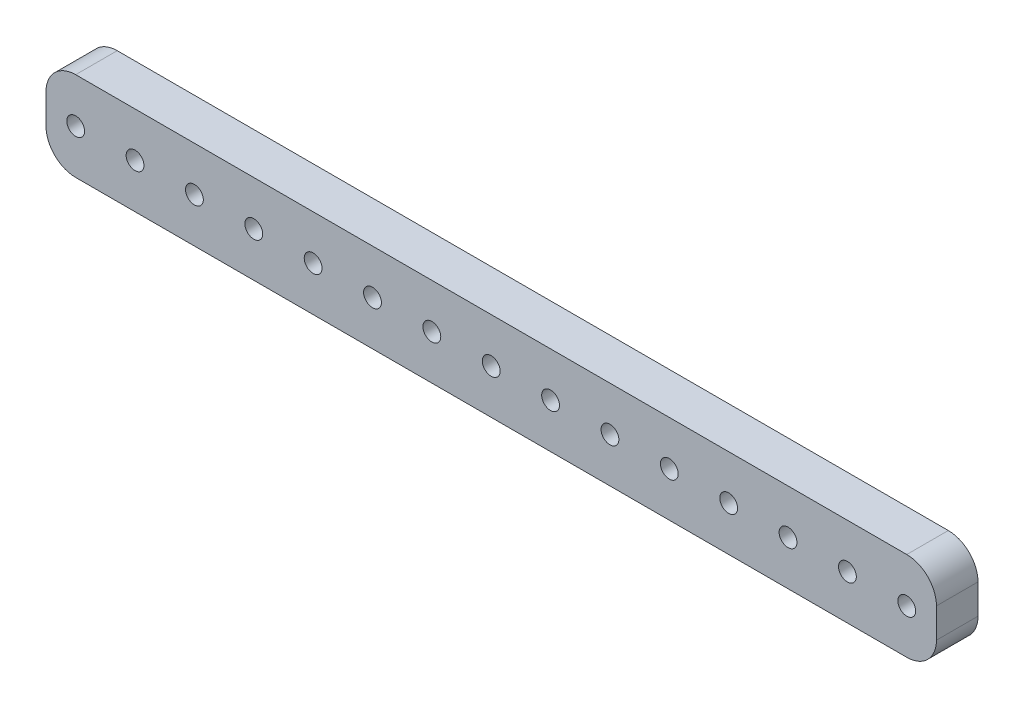
ISO-10303-21;
HEADER;
FILE_DESCRIPTION(('STEP AP214'),'2;1');
FILE_NAME('part.step','',(''),(''),'','','');
FILE_SCHEMA(('AUTOMOTIVE_DESIGN { 1 0 10303 214 1 1 1 1 }'));
ENDSEC;
DATA;
#1=APPLICATION_CONTEXT('core data for automotive mechanical design processes');
#2=APPLICATION_PROTOCOL_DEFINITION('international standard','automotive_design',2000,#1);
#3=PRODUCT_CONTEXT('',#1,'mechanical');
#4=PRODUCT('Part','Part','',(#3));
#5=PRODUCT_RELATED_PRODUCT_CATEGORY('part','',(#4));
#6=PRODUCT_DEFINITION_FORMATION('','',#4);
#7=PRODUCT_DEFINITION_CONTEXT('part definition',#1,'design');
#8=PRODUCT_DEFINITION('design','',#6,#7);
#9=PRODUCT_DEFINITION_SHAPE('','',#8);
#10=(LENGTH_UNIT() NAMED_UNIT(*) SI_UNIT(.MILLI.,.METRE.));
#11=(NAMED_UNIT(*) PLANE_ANGLE_UNIT() SI_UNIT($,.RADIAN.));
#12=(NAMED_UNIT(*) SI_UNIT($,.STERADIAN.) SOLID_ANGLE_UNIT());
#13=UNCERTAINTY_MEASURE_WITH_UNIT(LENGTH_MEASURE(1.E-05),#10,'distance_accuracy_value','');
#14=(GEOMETRIC_REPRESENTATION_CONTEXT(3) GLOBAL_UNCERTAINTY_ASSIGNED_CONTEXT((#13)) GLOBAL_UNIT_ASSIGNED_CONTEXT((#10,
#11,#12)) REPRESENTATION_CONTEXT('',''));
#15=CARTESIAN_POINT('',(0.,0.,0.));
#16=DIRECTION('',(0.,0.,1.));
#17=DIRECTION('',(1.,0.,0.));
#18=AXIS2_PLACEMENT_3D('',#15,#16,#17);
#19=CARTESIAN_POINT('',(150.,15.,14.));
#20=DIRECTION('',(-1.,0.,0.));
#21=DIRECTION('',(0.,0.,1.));
#22=AXIS2_PLACEMENT_3D('',#19,#20,#21);
#23=PLANE('',#22);
#24=DIRECTION('',(0.,1.,0.));
#25=VECTOR('',#24,1.);
#26=CARTESIAN_POINT('',(150.,15.,14.));
#27=LINE('',#26,#25);
#28=CARTESIAN_POINT('',(150.,-5.,14.));
#29=VERTEX_POINT('',#28);
#30=CARTESIAN_POINT('',(150.,5.,14.));
#31=VERTEX_POINT('',#30);
#32=EDGE_CURVE('E126',#29,#31,#27,.T.);
#33=ORIENTED_EDGE('',*,*,#32,.F.);
#34=DIRECTION('',(0.,0.,-1.));
#35=VECTOR('',#34,1.);
#36=CARTESIAN_POINT('',(150.,-5.,14.));
#37=LINE('',#36,#35);
#38=CARTESIAN_POINT('',(150.,-5.,0.));
#39=VERTEX_POINT('',#38);
#40=EDGE_CURVE('E11',#29,#39,#37,.T.);
#41=ORIENTED_EDGE('',*,*,#40,.T.);
#42=DIRECTION('',(0.,1.,0.));
#43=VECTOR('',#42,1.);
#44=CARTESIAN_POINT('',(150.,15.,0.));
#45=LINE('',#44,#43);
#46=CARTESIAN_POINT('',(150.,5.,0.));
#47=VERTEX_POINT('',#46);
#48=EDGE_CURVE('E157',#39,#47,#45,.T.);
#49=ORIENTED_EDGE('',*,*,#48,.T.);
#50=DIRECTION('',(0.,0.,-1.));
#51=VECTOR('',#50,1.);
#52=CARTESIAN_POINT('',(150.,5.,14.));
#53=LINE('',#52,#51);
#54=EDGE_CURVE('E40',#47,#31,#53,.F.);
#55=ORIENTED_EDGE('',*,*,#54,.T.);
#56=EDGE_LOOP('',(#33,#41,#49,#55));
#57=FACE_BOUND('',#56,.T.);
#58=ADVANCED_FACE('F32',(#57),#23,.F.);
#59=CARTESIAN_POINT('',(-150.,15.,14.));
#60=DIRECTION('',(0.,-1.,0.));
#61=DIRECTION('',(0.,0.,-1.));
#62=AXIS2_PLACEMENT_3D('',#59,#60,#61);
#63=PLANE('',#62);
#64=DIRECTION('',(-1.,0.,0.));
#65=VECTOR('',#64,1.);
#66=CARTESIAN_POINT('',(-150.,15.,0.));
#67=LINE('',#66,#65);
#68=CARTESIAN_POINT('',(140.,15.,0.));
#69=VERTEX_POINT('',#68);
#70=CARTESIAN_POINT('',(-140.,15.,0.));
#71=VERTEX_POINT('',#70);
#72=EDGE_CURVE('E131',#69,#71,#67,.T.);
#73=ORIENTED_EDGE('',*,*,#72,.T.);
#74=DIRECTION('',(0.,0.,-1.));
#75=VECTOR('',#74,1.);
#76=CARTESIAN_POINT('',(-140.,15.,14.));
#77=LINE('',#76,#75);
#78=CARTESIAN_POINT('',(-140.,15.,14.));
#79=VERTEX_POINT('',#78);
#80=EDGE_CURVE('E47',#71,#79,#77,.F.);
#81=ORIENTED_EDGE('',*,*,#80,.T.);
#82=DIRECTION('',(-1.,0.,0.));
#83=VECTOR('',#82,1.);
#84=CARTESIAN_POINT('',(-150.,15.,14.));
#85=LINE('',#84,#83);
#86=CARTESIAN_POINT('',(140.,15.,14.));
#87=VERTEX_POINT('',#86);
#88=EDGE_CURVE('E129',#87,#79,#85,.T.);
#89=ORIENTED_EDGE('',*,*,#88,.F.);
#90=DIRECTION('',(0.,0.,-1.));
#91=VECTOR('',#90,1.);
#92=CARTESIAN_POINT('',(140.,15.,14.));
#93=LINE('',#92,#91);
#94=EDGE_CURVE('E149',#87,#69,#93,.T.);
#95=ORIENTED_EDGE('',*,*,#94,.T.);
#96=EDGE_LOOP('',(#73,#81,#89,#95));
#97=FACE_BOUND('',#96,.T.);
#98=ADVANCED_FACE('F164',(#97),#63,.F.);
#99=CARTESIAN_POINT('',(-150.,15.,14.));
#100=DIRECTION('',(1.,0.,0.));
#101=DIRECTION('',(0.,0.,-1.));
#102=AXIS2_PLACEMENT_3D('',#99,#100,#101);
#103=PLANE('',#102);
#104=DIRECTION('',(0.,-1.,0.));
#105=VECTOR('',#104,1.);
#106=CARTESIAN_POINT('',(-150.,15.,0.));
#107=LINE('',#106,#105);
#108=CARTESIAN_POINT('',(-150.,5.,0.));
#109=VERTEX_POINT('',#108);
#110=CARTESIAN_POINT('',(-150.,-5.,0.));
#111=VERTEX_POINT('',#110);
#112=EDGE_CURVE('E127',#109,#111,#107,.T.);
#113=ORIENTED_EDGE('',*,*,#112,.T.);
#114=DIRECTION('',(0.,0.,-1.));
#115=VECTOR('',#114,1.);
#116=CARTESIAN_POINT('',(-150.,-5.,14.));
#117=LINE('',#116,#115);
#118=CARTESIAN_POINT('',(-150.,-5.,14.));
#119=VERTEX_POINT('',#118);
#120=EDGE_CURVE('E104',#111,#119,#117,.F.);
#121=ORIENTED_EDGE('',*,*,#120,.T.);
#122=DIRECTION('',(0.,-1.,0.));
#123=VECTOR('',#122,1.);
#124=CARTESIAN_POINT('',(-150.,15.,14.));
#125=LINE('',#124,#123);
#126=CARTESIAN_POINT('',(-150.,5.,14.));
#127=VERTEX_POINT('',#126);
#128=EDGE_CURVE('E169',#127,#119,#125,.T.);
#129=ORIENTED_EDGE('',*,*,#128,.F.);
#130=DIRECTION('',(0.,0.,-1.));
#131=VECTOR('',#130,1.);
#132=CARTESIAN_POINT('',(-150.,5.,14.));
#133=LINE('',#132,#131);
#134=EDGE_CURVE('E109',#127,#109,#133,.T.);
#135=ORIENTED_EDGE('',*,*,#134,.T.);
#136=EDGE_LOOP('',(#113,#121,#129,#135));
#137=FACE_BOUND('',#136,.T.);
#138=ADVANCED_FACE('F314',(#137),#103,.F.);
#139=CARTESIAN_POINT('',(-150.,-15.,14.));
#140=DIRECTION('',(0.,1.,0.));
#141=DIRECTION('',(0.,0.,1.));
#142=AXIS2_PLACEMENT_3D('',#139,#140,#141);
#143=PLANE('',#142);
#144=DIRECTION('',(1.,0.,0.));
#145=VECTOR('',#144,1.);
#146=CARTESIAN_POINT('',(-150.,-15.,14.));
#147=LINE('',#146,#145);
#148=CARTESIAN_POINT('',(-140.,-15.,14.));
#149=VERTEX_POINT('',#148);
#150=CARTESIAN_POINT('',(140.,-15.,14.));
#151=VERTEX_POINT('',#150);
#152=EDGE_CURVE('E119',#149,#151,#147,.T.);
#153=ORIENTED_EDGE('',*,*,#152,.F.);
#154=DIRECTION('',(0.,0.,-1.));
#155=VECTOR('',#154,1.);
#156=CARTESIAN_POINT('',(-140.,-15.,14.));
#157=LINE('',#156,#155);
#158=CARTESIAN_POINT('',(-140.,-15.,0.));
#159=VERTEX_POINT('',#158);
#160=EDGE_CURVE('E103',#149,#159,#157,.T.);
#161=ORIENTED_EDGE('',*,*,#160,.T.);
#162=DIRECTION('',(1.,0.,0.));
#163=VECTOR('',#162,1.);
#164=CARTESIAN_POINT('',(-150.,-15.,0.));
#165=LINE('',#164,#163);
#166=CARTESIAN_POINT('',(140.,-15.,0.));
#167=VERTEX_POINT('',#166);
#168=EDGE_CURVE('E116',#159,#167,#165,.T.);
#169=ORIENTED_EDGE('',*,*,#168,.T.);
#170=DIRECTION('',(0.,0.,-1.));
#171=VECTOR('',#170,1.);
#172=CARTESIAN_POINT('',(140.,-15.,14.));
#173=LINE('',#172,#171);
#174=EDGE_CURVE('E121',#167,#151,#173,.F.);
#175=ORIENTED_EDGE('',*,*,#174,.T.);
#176=EDGE_LOOP('',(#153,#161,#169,#175));
#177=FACE_BOUND('',#176,.T.);
#178=ADVANCED_FACE('F115',(#177),#143,.F.);
#179=CARTESIAN_POINT('',(0.,0.,14.));
#180=DIRECTION('',(0.,0.,1.));
#181=DIRECTION('',(1.,0.,0.));
#182=AXIS2_PLACEMENT_3D('',#179,#180,#181);
#183=PLANE('',#182);
#184=CARTESIAN_POINT('',(20.,0.,14.));
#185=DIRECTION('',(0.,0.,1.));
#186=DIRECTION('',(1.,0.,0.));
#187=AXIS2_PLACEMENT_3D('',#184,#185,#186);
#188=CIRCLE('',#187,3.);
#189=CARTESIAN_POINT('',(23.,0.,14.));
#190=VERTEX_POINT('',#189);
#191=EDGE_CURVE('E258',#190,#190,#188,.T.);
#192=ORIENTED_EDGE('',*,*,#191,.F.);
#193=EDGE_LOOP('',(#192));
#194=FACE_BOUND('',#193,.T.);
#195=CARTESIAN_POINT('',(0.,0.,14.));
#196=DIRECTION('',(0.,0.,1.));
#197=DIRECTION('',(1.,0.,0.));
#198=AXIS2_PLACEMENT_3D('',#195,#196,#197);
#199=CIRCLE('',#198,3.);
#200=CARTESIAN_POINT('',(3.00000000000005,0.,14.));
#201=VERTEX_POINT('',#200);
#202=EDGE_CURVE('E252',#201,#201,#199,.T.);
#203=ORIENTED_EDGE('',*,*,#202,.F.);
#204=EDGE_LOOP('',(#203));
#205=FACE_BOUND('',#204,.T.);
#206=CARTESIAN_POINT('',(-20.,0.,14.));
#207=DIRECTION('',(0.,0.,1.));
#208=DIRECTION('',(1.,0.,0.));
#209=AXIS2_PLACEMENT_3D('',#206,#207,#208);
#210=CIRCLE('',#209,3.);
#211=CARTESIAN_POINT('',(-16.9999999999999,0.,14.));
#212=VERTEX_POINT('',#211);
#213=EDGE_CURVE('E246',#212,#212,#210,.T.);
#214=ORIENTED_EDGE('',*,*,#213,.F.);
#215=EDGE_LOOP('',(#214));
#216=FACE_BOUND('',#215,.T.);
#217=CARTESIAN_POINT('',(40.,0.,14.));
#218=DIRECTION('',(0.,0.,1.));
#219=DIRECTION('',(1.,0.,0.));
#220=AXIS2_PLACEMENT_3D('',#217,#218,#219);
#221=CIRCLE('',#220,3.);
#222=CARTESIAN_POINT('',(43.,0.,14.));
#223=VERTEX_POINT('',#222);
#224=EDGE_CURVE('E240',#223,#223,#221,.T.);
#225=ORIENTED_EDGE('',*,*,#224,.F.);
#226=EDGE_LOOP('',(#225));
#227=FACE_BOUND('',#226,.T.);
#228=CARTESIAN_POINT('',(60.,0.,14.));
#229=DIRECTION('',(0.,0.,1.));
#230=DIRECTION('',(1.,0.,0.));
#231=AXIS2_PLACEMENT_3D('',#228,#229,#230);
#232=CIRCLE('',#231,3.00000000000001);
#233=CARTESIAN_POINT('',(63.,0.,14.));
#234=VERTEX_POINT('',#233);
#235=EDGE_CURVE('E234',#234,#234,#232,.T.);
#236=ORIENTED_EDGE('',*,*,#235,.F.);
#237=EDGE_LOOP('',(#236));
#238=FACE_BOUND('',#237,.T.);
#239=CARTESIAN_POINT('',(-40.,0.,14.));
#240=DIRECTION('',(0.,0.,1.));
#241=DIRECTION('',(1.,0.,0.));
#242=AXIS2_PLACEMENT_3D('',#239,#240,#241);
#243=CIRCLE('',#242,3.);
#244=CARTESIAN_POINT('',(-37.,0.,14.));
#245=VERTEX_POINT('',#244);
#246=EDGE_CURVE('E228',#245,#245,#243,.T.);
#247=ORIENTED_EDGE('',*,*,#246,.F.);
#248=EDGE_LOOP('',(#247));
#249=FACE_BOUND('',#248,.T.);
#250=CARTESIAN_POINT('',(-60.,0.,14.));
#251=DIRECTION('',(0.,0.,1.));
#252=DIRECTION('',(1.,0.,0.));
#253=AXIS2_PLACEMENT_3D('',#250,#251,#252);
#254=CIRCLE('',#253,2.99999999999999);
#255=CARTESIAN_POINT('',(-57.,0.,14.));
#256=VERTEX_POINT('',#255);
#257=EDGE_CURVE('E222',#256,#256,#254,.T.);
#258=ORIENTED_EDGE('',*,*,#257,.F.);
#259=EDGE_LOOP('',(#258));
#260=FACE_BOUND('',#259,.T.);
#261=CARTESIAN_POINT('',(80.,0.,14.));
#262=DIRECTION('',(0.,0.,1.));
#263=DIRECTION('',(1.,0.,0.));
#264=AXIS2_PLACEMENT_3D('',#261,#262,#263);
#265=CIRCLE('',#264,3.00000000000001);
#266=CARTESIAN_POINT('',(83.,0.,14.));
#267=VERTEX_POINT('',#266);
#268=EDGE_CURVE('E216',#267,#267,#265,.T.);
#269=ORIENTED_EDGE('',*,*,#268,.F.);
#270=EDGE_LOOP('',(#269));
#271=FACE_BOUND('',#270,.T.);
#272=CARTESIAN_POINT('',(-80.,0.,14.));
#273=DIRECTION('',(0.,0.,1.));
#274=DIRECTION('',(1.,0.,0.));
#275=AXIS2_PLACEMENT_3D('',#272,#273,#274);
#276=CIRCLE('',#275,3.00000000000001);
#277=CARTESIAN_POINT('',(-77.,0.,14.));
#278=VERTEX_POINT('',#277);
#279=EDGE_CURVE('E210',#278,#278,#276,.T.);
#280=ORIENTED_EDGE('',*,*,#279,.F.);
#281=EDGE_LOOP('',(#280));
#282=FACE_BOUND('',#281,.T.);
#283=CARTESIAN_POINT('',(140.,0.,14.));
#284=DIRECTION('',(0.,0.,1.));
#285=DIRECTION('',(1.,0.,0.));
#286=AXIS2_PLACEMENT_3D('',#283,#284,#285);
#287=CIRCLE('',#286,2.99999999999999);
#288=CARTESIAN_POINT('',(143.,0.,14.));
#289=VERTEX_POINT('',#288);
#290=EDGE_CURVE('E204',#289,#289,#287,.T.);
#291=ORIENTED_EDGE('',*,*,#290,.F.);
#292=EDGE_LOOP('',(#291));
#293=FACE_BOUND('',#292,.T.);
#294=CARTESIAN_POINT('',(120.,0.,14.));
#295=DIRECTION('',(0.,0.,1.));
#296=DIRECTION('',(1.,0.,0.));
#297=AXIS2_PLACEMENT_3D('',#294,#295,#296);
#298=CIRCLE('',#297,3.00000000000001);
#299=CARTESIAN_POINT('',(123.,0.,14.));
#300=VERTEX_POINT('',#299);
#301=EDGE_CURVE('E198',#300,#300,#298,.T.);
#302=ORIENTED_EDGE('',*,*,#301,.F.);
#303=EDGE_LOOP('',(#302));
#304=FACE_BOUND('',#303,.T.);
#305=CARTESIAN_POINT('',(-120.,0.,14.));
#306=DIRECTION('',(0.,0.,1.));
#307=DIRECTION('',(1.,0.,0.));
#308=AXIS2_PLACEMENT_3D('',#305,#306,#307);
#309=CIRCLE('',#308,3.00000000000001);
#310=CARTESIAN_POINT('',(-117.,0.,14.));
#311=VERTEX_POINT('',#310);
#312=EDGE_CURVE('E192',#311,#311,#309,.T.);
#313=ORIENTED_EDGE('',*,*,#312,.F.);
#314=EDGE_LOOP('',(#313));
#315=FACE_BOUND('',#314,.T.);
#316=CARTESIAN_POINT('',(-140.,0.,14.));
#317=DIRECTION('',(0.,0.,1.));
#318=DIRECTION('',(1.,0.,0.));
#319=AXIS2_PLACEMENT_3D('',#316,#317,#318);
#320=CIRCLE('',#319,2.99999999999999);
#321=CARTESIAN_POINT('',(-137.,0.,14.));
#322=VERTEX_POINT('',#321);
#323=EDGE_CURVE('E186',#322,#322,#320,.T.);
#324=ORIENTED_EDGE('',*,*,#323,.F.);
#325=EDGE_LOOP('',(#324));
#326=FACE_BOUND('',#325,.T.);
#327=CARTESIAN_POINT('',(-100.,0.,14.));
#328=DIRECTION('',(0.,0.,1.));
#329=DIRECTION('',(1.,0.,0.));
#330=AXIS2_PLACEMENT_3D('',#327,#328,#329);
#331=CIRCLE('',#330,3.00000000000001);
#332=CARTESIAN_POINT('',(-97.,0.,14.));
#333=VERTEX_POINT('',#332);
#334=EDGE_CURVE('E180',#333,#333,#331,.T.);
#335=ORIENTED_EDGE('',*,*,#334,.F.);
#336=EDGE_LOOP('',(#335));
#337=FACE_BOUND('',#336,.T.);
#338=CARTESIAN_POINT('',(100.,0.,14.));
#339=DIRECTION('',(0.,0.,1.));
#340=DIRECTION('',(1.,0.,0.));
#341=AXIS2_PLACEMENT_3D('',#338,#339,#340);
#342=CIRCLE('',#341,3.00000000000001);
#343=CARTESIAN_POINT('',(103.,0.,14.));
#344=VERTEX_POINT('',#343);
#345=EDGE_CURVE('E174',#344,#344,#342,.T.);
#346=ORIENTED_EDGE('',*,*,#345,.F.);
#347=EDGE_LOOP('',(#346));
#348=FACE_BOUND('',#347,.T.);
#349=ORIENTED_EDGE('',*,*,#128,.T.);
#350=CARTESIAN_POINT('',(-140.,-5.,14.));
#351=DIRECTION('',(0.,0.,1.));
#352=DIRECTION('',(1.,0.,0.));
#353=AXIS2_PLACEMENT_3D('',#350,#351,#352);
#354=CIRCLE('',#353,10.);
#355=EDGE_CURVE('E147',#119,#149,#354,.T.);
#356=ORIENTED_EDGE('',*,*,#355,.T.);
#357=ORIENTED_EDGE('',*,*,#152,.T.);
#358=CARTESIAN_POINT('',(140.,-5.,14.));
#359=DIRECTION('',(0.,0.,1.));
#360=DIRECTION('',(1.,0.,0.));
#361=AXIS2_PLACEMENT_3D('',#358,#359,#360);
#362=CIRCLE('',#361,10.);
#363=EDGE_CURVE('E143',#151,#29,#362,.T.);
#364=ORIENTED_EDGE('',*,*,#363,.T.);
#365=ORIENTED_EDGE('',*,*,#32,.T.);
#366=CARTESIAN_POINT('',(140.,5.,14.));
#367=DIRECTION('',(0.,0.,1.));
#368=DIRECTION('',(1.,0.,0.));
#369=AXIS2_PLACEMENT_3D('',#366,#367,#368);
#370=CIRCLE('',#369,10.);
#371=EDGE_CURVE('E54',#31,#87,#370,.T.);
#372=ORIENTED_EDGE('',*,*,#371,.T.);
#373=ORIENTED_EDGE('',*,*,#88,.T.);
#374=CARTESIAN_POINT('',(-140.,5.,14.));
#375=DIRECTION('',(0.,0.,1.));
#376=DIRECTION('',(1.,0.,0.));
#377=AXIS2_PLACEMENT_3D('',#374,#375,#376);
#378=CIRCLE('',#377,10.);
#379=EDGE_CURVE('E145',#79,#127,#378,.T.);
#380=ORIENTED_EDGE('',*,*,#379,.T.);
#381=EDGE_LOOP('',(#349,#356,#357,#364,#365,#372,#373,#380));
#382=FACE_BOUND('',#381,.T.);
#383=ADVANCED_FACE('F160',(#194,#205,#216,#227,#238,#249,#260,#271,#282,#293,#304,#315,#326,
#337,#348,#382),#183,.T.);
#384=CARTESIAN_POINT('',(0.,0.,0.));
#385=DIRECTION('',(0.,0.,1.));
#386=DIRECTION('',(1.,0.,0.));
#387=AXIS2_PLACEMENT_3D('',#384,#385,#386);
#388=PLANE('',#387);
#389=CARTESIAN_POINT('',(20.,0.,0.));
#390=DIRECTION('',(0.,0.,1.));
#391=DIRECTION('',(1.,0.,0.));
#392=AXIS2_PLACEMENT_3D('',#389,#390,#391);
#393=CIRCLE('',#392,3.);
#394=CARTESIAN_POINT('',(23.,0.,0.));
#395=VERTEX_POINT('',#394);
#396=EDGE_CURVE('E255',#395,#395,#393,.F.);
#397=ORIENTED_EDGE('',*,*,#396,.F.);
#398=EDGE_LOOP('',(#397));
#399=FACE_BOUND('',#398,.T.);
#400=CARTESIAN_POINT('',(0.,0.,0.));
#401=DIRECTION('',(0.,0.,1.));
#402=DIRECTION('',(1.,0.,0.));
#403=AXIS2_PLACEMENT_3D('',#400,#401,#402);
#404=CIRCLE('',#403,3.);
#405=CARTESIAN_POINT('',(3.00000000000005,0.,0.));
#406=VERTEX_POINT('',#405);
#407=EDGE_CURVE('E249',#406,#406,#404,.F.);
#408=ORIENTED_EDGE('',*,*,#407,.F.);
#409=EDGE_LOOP('',(#408));
#410=FACE_BOUND('',#409,.T.);
#411=CARTESIAN_POINT('',(-20.,0.,0.));
#412=DIRECTION('',(0.,0.,1.));
#413=DIRECTION('',(1.,0.,0.));
#414=AXIS2_PLACEMENT_3D('',#411,#412,#413);
#415=CIRCLE('',#414,3.);
#416=CARTESIAN_POINT('',(-16.9999999999999,0.,0.));
#417=VERTEX_POINT('',#416);
#418=EDGE_CURVE('E243',#417,#417,#415,.F.);
#419=ORIENTED_EDGE('',*,*,#418,.F.);
#420=EDGE_LOOP('',(#419));
#421=FACE_BOUND('',#420,.T.);
#422=CARTESIAN_POINT('',(40.,0.,0.));
#423=DIRECTION('',(0.,0.,1.));
#424=DIRECTION('',(1.,0.,0.));
#425=AXIS2_PLACEMENT_3D('',#422,#423,#424);
#426=CIRCLE('',#425,3.);
#427=CARTESIAN_POINT('',(43.,0.,0.));
#428=VERTEX_POINT('',#427);
#429=EDGE_CURVE('E237',#428,#428,#426,.F.);
#430=ORIENTED_EDGE('',*,*,#429,.F.);
#431=EDGE_LOOP('',(#430));
#432=FACE_BOUND('',#431,.T.);
#433=CARTESIAN_POINT('',(60.,0.,0.));
#434=DIRECTION('',(0.,0.,1.));
#435=DIRECTION('',(1.,0.,0.));
#436=AXIS2_PLACEMENT_3D('',#433,#434,#435);
#437=CIRCLE('',#436,3.00000000000001);
#438=CARTESIAN_POINT('',(63.,0.,0.));
#439=VERTEX_POINT('',#438);
#440=EDGE_CURVE('E231',#439,#439,#437,.F.);
#441=ORIENTED_EDGE('',*,*,#440,.F.);
#442=EDGE_LOOP('',(#441));
#443=FACE_BOUND('',#442,.T.);
#444=CARTESIAN_POINT('',(-40.,0.,0.));
#445=DIRECTION('',(0.,0.,1.));
#446=DIRECTION('',(1.,0.,0.));
#447=AXIS2_PLACEMENT_3D('',#444,#445,#446);
#448=CIRCLE('',#447,3.);
#449=CARTESIAN_POINT('',(-37.,0.,0.));
#450=VERTEX_POINT('',#449);
#451=EDGE_CURVE('E225',#450,#450,#448,.F.);
#452=ORIENTED_EDGE('',*,*,#451,.F.);
#453=EDGE_LOOP('',(#452));
#454=FACE_BOUND('',#453,.T.);
#455=CARTESIAN_POINT('',(-60.,0.,0.));
#456=DIRECTION('',(0.,0.,1.));
#457=DIRECTION('',(1.,0.,0.));
#458=AXIS2_PLACEMENT_3D('',#455,#456,#457);
#459=CIRCLE('',#458,2.99999999999999);
#460=CARTESIAN_POINT('',(-57.,0.,0.));
#461=VERTEX_POINT('',#460);
#462=EDGE_CURVE('E219',#461,#461,#459,.F.);
#463=ORIENTED_EDGE('',*,*,#462,.F.);
#464=EDGE_LOOP('',(#463));
#465=FACE_BOUND('',#464,.T.);
#466=CARTESIAN_POINT('',(80.,0.,0.));
#467=DIRECTION('',(0.,0.,1.));
#468=DIRECTION('',(1.,0.,0.));
#469=AXIS2_PLACEMENT_3D('',#466,#467,#468);
#470=CIRCLE('',#469,3.00000000000001);
#471=CARTESIAN_POINT('',(83.,0.,0.));
#472=VERTEX_POINT('',#471);
#473=EDGE_CURVE('E213',#472,#472,#470,.F.);
#474=ORIENTED_EDGE('',*,*,#473,.F.);
#475=EDGE_LOOP('',(#474));
#476=FACE_BOUND('',#475,.T.);
#477=CARTESIAN_POINT('',(-80.,0.,0.));
#478=DIRECTION('',(0.,0.,1.));
#479=DIRECTION('',(1.,0.,0.));
#480=AXIS2_PLACEMENT_3D('',#477,#478,#479);
#481=CIRCLE('',#480,3.00000000000001);
#482=CARTESIAN_POINT('',(-77.,0.,0.));
#483=VERTEX_POINT('',#482);
#484=EDGE_CURVE('E207',#483,#483,#481,.F.);
#485=ORIENTED_EDGE('',*,*,#484,.F.);
#486=EDGE_LOOP('',(#485));
#487=FACE_BOUND('',#486,.T.);
#488=CARTESIAN_POINT('',(140.,0.,0.));
#489=DIRECTION('',(0.,0.,1.));
#490=DIRECTION('',(1.,0.,0.));
#491=AXIS2_PLACEMENT_3D('',#488,#489,#490);
#492=CIRCLE('',#491,2.99999999999999);
#493=CARTESIAN_POINT('',(143.,0.,0.));
#494=VERTEX_POINT('',#493);
#495=EDGE_CURVE('E201',#494,#494,#492,.F.);
#496=ORIENTED_EDGE('',*,*,#495,.F.);
#497=EDGE_LOOP('',(#496));
#498=FACE_BOUND('',#497,.T.);
#499=CARTESIAN_POINT('',(120.,0.,0.));
#500=DIRECTION('',(0.,0.,1.));
#501=DIRECTION('',(1.,0.,0.));
#502=AXIS2_PLACEMENT_3D('',#499,#500,#501);
#503=CIRCLE('',#502,3.00000000000001);
#504=CARTESIAN_POINT('',(123.,0.,0.));
#505=VERTEX_POINT('',#504);
#506=EDGE_CURVE('E195',#505,#505,#503,.F.);
#507=ORIENTED_EDGE('',*,*,#506,.F.);
#508=EDGE_LOOP('',(#507));
#509=FACE_BOUND('',#508,.T.);
#510=CARTESIAN_POINT('',(-120.,0.,0.));
#511=DIRECTION('',(0.,0.,1.));
#512=DIRECTION('',(1.,0.,0.));
#513=AXIS2_PLACEMENT_3D('',#510,#511,#512);
#514=CIRCLE('',#513,3.00000000000001);
#515=CARTESIAN_POINT('',(-117.,0.,0.));
#516=VERTEX_POINT('',#515);
#517=EDGE_CURVE('E189',#516,#516,#514,.F.);
#518=ORIENTED_EDGE('',*,*,#517,.F.);
#519=EDGE_LOOP('',(#518));
#520=FACE_BOUND('',#519,.T.);
#521=CARTESIAN_POINT('',(-140.,0.,0.));
#522=DIRECTION('',(0.,0.,1.));
#523=DIRECTION('',(1.,0.,0.));
#524=AXIS2_PLACEMENT_3D('',#521,#522,#523);
#525=CIRCLE('',#524,2.99999999999999);
#526=CARTESIAN_POINT('',(-137.,0.,0.));
#527=VERTEX_POINT('',#526);
#528=EDGE_CURVE('E183',#527,#527,#525,.F.);
#529=ORIENTED_EDGE('',*,*,#528,.F.);
#530=EDGE_LOOP('',(#529));
#531=FACE_BOUND('',#530,.T.);
#532=CARTESIAN_POINT('',(-100.,0.,0.));
#533=DIRECTION('',(0.,0.,1.));
#534=DIRECTION('',(1.,0.,0.));
#535=AXIS2_PLACEMENT_3D('',#532,#533,#534);
#536=CIRCLE('',#535,3.00000000000001);
#537=CARTESIAN_POINT('',(-97.,0.,0.));
#538=VERTEX_POINT('',#537);
#539=EDGE_CURVE('E177',#538,#538,#536,.F.);
#540=ORIENTED_EDGE('',*,*,#539,.F.);
#541=EDGE_LOOP('',(#540));
#542=FACE_BOUND('',#541,.T.);
#543=CARTESIAN_POINT('',(100.,0.,0.));
#544=DIRECTION('',(0.,0.,1.));
#545=DIRECTION('',(1.,0.,0.));
#546=AXIS2_PLACEMENT_3D('',#543,#544,#545);
#547=CIRCLE('',#546,3.00000000000001);
#548=CARTESIAN_POINT('',(103.,0.,0.));
#549=VERTEX_POINT('',#548);
#550=EDGE_CURVE('E165',#549,#549,#547,.F.);
#551=ORIENTED_EDGE('',*,*,#550,.F.);
#552=EDGE_LOOP('',(#551));
#553=FACE_BOUND('',#552,.T.);
#554=ORIENTED_EDGE('',*,*,#168,.F.);
#555=CARTESIAN_POINT('',(-140.,-5.,0.));
#556=DIRECTION('',(0.,0.,1.));
#557=DIRECTION('',(1.,0.,0.));
#558=AXIS2_PLACEMENT_3D('',#555,#556,#557);
#559=CIRCLE('',#558,10.);
#560=EDGE_CURVE('E99',#159,#111,#559,.F.);
#561=ORIENTED_EDGE('',*,*,#560,.T.);
#562=ORIENTED_EDGE('',*,*,#112,.F.);
#563=CARTESIAN_POINT('',(-140.,5.,0.));
#564=DIRECTION('',(0.,0.,1.));
#565=DIRECTION('',(1.,0.,0.));
#566=AXIS2_PLACEMENT_3D('',#563,#564,#565);
#567=CIRCLE('',#566,10.);
#568=EDGE_CURVE('E110',#109,#71,#567,.F.);
#569=ORIENTED_EDGE('',*,*,#568,.T.);
#570=ORIENTED_EDGE('',*,*,#72,.F.);
#571=CARTESIAN_POINT('',(140.,5.,0.));
#572=DIRECTION('',(0.,0.,1.));
#573=DIRECTION('',(1.,0.,0.));
#574=AXIS2_PLACEMENT_3D('',#571,#572,#573);
#575=CIRCLE('',#574,10.);
#576=EDGE_CURVE('E120',#69,#47,#575,.F.);
#577=ORIENTED_EDGE('',*,*,#576,.T.);
#578=ORIENTED_EDGE('',*,*,#48,.F.);
#579=CARTESIAN_POINT('',(140.,-5.,0.));
#580=DIRECTION('',(0.,0.,1.));
#581=DIRECTION('',(1.,0.,0.));
#582=AXIS2_PLACEMENT_3D('',#579,#580,#581);
#583=CIRCLE('',#582,10.);
#584=EDGE_CURVE('E125',#39,#167,#583,.F.);
#585=ORIENTED_EDGE('',*,*,#584,.T.);
#586=EDGE_LOOP('',(#554,#561,#562,#569,#570,#577,#578,#585));
#587=FACE_BOUND('',#586,.T.);
#588=ADVANCED_FACE('F123',(#399,#410,#421,#432,#443,#454,#465,#476,#487,#498,#509,#520,#531,
#542,#553,#587),#388,.F.);
#589=CARTESIAN_POINT('',(100.,0.,-8.48528137423859));
#590=DIRECTION('',(0.,0.,1.));
#591=DIRECTION('',(1.,0.,0.));
#592=AXIS2_PLACEMENT_3D('',#589,#590,#591);
#593=CYLINDRICAL_SURFACE('',#592,3.00000000000001);
#594=ORIENTED_EDGE('',*,*,#550,.T.);
#595=EDGE_LOOP('',(#594));
#596=FACE_BOUND('',#595,.T.);
#597=ORIENTED_EDGE('',*,*,#345,.T.);
#598=EDGE_LOOP('',(#597));
#599=FACE_BOUND('',#598,.T.);
#600=ADVANCED_FACE('F295',(#596,#599),#593,.F.);
#601=CARTESIAN_POINT('',(-100.,0.,-8.48528137423859));
#602=DIRECTION('',(0.,0.,1.));
#603=DIRECTION('',(1.,0.,0.));
#604=AXIS2_PLACEMENT_3D('',#601,#602,#603);
#605=CYLINDRICAL_SURFACE('',#604,3.00000000000001);
#606=ORIENTED_EDGE('',*,*,#539,.T.);
#607=EDGE_LOOP('',(#606));
#608=FACE_BOUND('',#607,.T.);
#609=ORIENTED_EDGE('',*,*,#334,.T.);
#610=EDGE_LOOP('',(#609));
#611=FACE_BOUND('',#610,.T.);
#612=ADVANCED_FACE('F297',(#608,#611),#605,.F.);
#613=CARTESIAN_POINT('',(-140.,0.,-8.48528137423859));
#614=DIRECTION('',(0.,0.,1.));
#615=DIRECTION('',(1.,0.,0.));
#616=AXIS2_PLACEMENT_3D('',#613,#614,#615);
#617=CYLINDRICAL_SURFACE('',#616,2.99999999999999);
#618=ORIENTED_EDGE('',*,*,#528,.T.);
#619=EDGE_LOOP('',(#618));
#620=FACE_BOUND('',#619,.T.);
#621=ORIENTED_EDGE('',*,*,#323,.T.);
#622=EDGE_LOOP('',(#621));
#623=FACE_BOUND('',#622,.T.);
#624=ADVANCED_FACE('F304',(#620,#623),#617,.F.);
#625=CARTESIAN_POINT('',(-120.,0.,-8.48528137423859));
#626=DIRECTION('',(0.,0.,1.));
#627=DIRECTION('',(1.,0.,0.));
#628=AXIS2_PLACEMENT_3D('',#625,#626,#627);
#629=CYLINDRICAL_SURFACE('',#628,3.00000000000001);
#630=ORIENTED_EDGE('',*,*,#517,.T.);
#631=EDGE_LOOP('',(#630));
#632=FACE_BOUND('',#631,.T.);
#633=ORIENTED_EDGE('',*,*,#312,.T.);
#634=EDGE_LOOP('',(#633));
#635=FACE_BOUND('',#634,.T.);
#636=ADVANCED_FACE('F459',(#632,#635),#629,.F.);
#637=CARTESIAN_POINT('',(120.,0.,-8.48528137423859));
#638=DIRECTION('',(0.,0.,1.));
#639=DIRECTION('',(1.,0.,0.));
#640=AXIS2_PLACEMENT_3D('',#637,#638,#639);
#641=CYLINDRICAL_SURFACE('',#640,3.00000000000001);
#642=ORIENTED_EDGE('',*,*,#506,.T.);
#643=EDGE_LOOP('',(#642));
#644=FACE_BOUND('',#643,.T.);
#645=ORIENTED_EDGE('',*,*,#301,.T.);
#646=EDGE_LOOP('',(#645));
#647=FACE_BOUND('',#646,.T.);
#648=ADVANCED_FACE('F451',(#644,#647),#641,.F.);
#649=CARTESIAN_POINT('',(140.,0.,-8.48528137423859));
#650=DIRECTION('',(0.,0.,1.));
#651=DIRECTION('',(1.,0.,0.));
#652=AXIS2_PLACEMENT_3D('',#649,#650,#651);
#653=CYLINDRICAL_SURFACE('',#652,2.99999999999999);
#654=ORIENTED_EDGE('',*,*,#495,.T.);
#655=EDGE_LOOP('',(#654));
#656=FACE_BOUND('',#655,.T.);
#657=ORIENTED_EDGE('',*,*,#290,.T.);
#658=EDGE_LOOP('',(#657));
#659=FACE_BOUND('',#658,.T.);
#660=ADVANCED_FACE('F443',(#656,#659),#653,.F.);
#661=CARTESIAN_POINT('',(-80.,0.,-8.48528137423859));
#662=DIRECTION('',(0.,0.,1.));
#663=DIRECTION('',(1.,0.,0.));
#664=AXIS2_PLACEMENT_3D('',#661,#662,#663);
#665=CYLINDRICAL_SURFACE('',#664,3.00000000000001);
#666=ORIENTED_EDGE('',*,*,#484,.T.);
#667=EDGE_LOOP('',(#666));
#668=FACE_BOUND('',#667,.T.);
#669=ORIENTED_EDGE('',*,*,#279,.T.);
#670=EDGE_LOOP('',(#669));
#671=FACE_BOUND('',#670,.T.);
#672=ADVANCED_FACE('F435',(#668,#671),#665,.F.);
#673=CARTESIAN_POINT('',(80.,0.,-8.48528137423859));
#674=DIRECTION('',(0.,0.,1.));
#675=DIRECTION('',(1.,0.,0.));
#676=AXIS2_PLACEMENT_3D('',#673,#674,#675);
#677=CYLINDRICAL_SURFACE('',#676,3.00000000000001);
#678=ORIENTED_EDGE('',*,*,#473,.T.);
#679=EDGE_LOOP('',(#678));
#680=FACE_BOUND('',#679,.T.);
#681=ORIENTED_EDGE('',*,*,#268,.T.);
#682=EDGE_LOOP('',(#681));
#683=FACE_BOUND('',#682,.T.);
#684=ADVANCED_FACE('F427',(#680,#683),#677,.F.);
#685=CARTESIAN_POINT('',(-60.,0.,-8.48528137423859));
#686=DIRECTION('',(0.,0.,1.));
#687=DIRECTION('',(1.,0.,0.));
#688=AXIS2_PLACEMENT_3D('',#685,#686,#687);
#689=CYLINDRICAL_SURFACE('',#688,2.99999999999999);
#690=ORIENTED_EDGE('',*,*,#462,.T.);
#691=EDGE_LOOP('',(#690));
#692=FACE_BOUND('',#691,.T.);
#693=ORIENTED_EDGE('',*,*,#257,.T.);
#694=EDGE_LOOP('',(#693));
#695=FACE_BOUND('',#694,.T.);
#696=ADVANCED_FACE('F419',(#692,#695),#689,.F.);
#697=CARTESIAN_POINT('',(-40.,0.,-8.48528137423859));
#698=DIRECTION('',(0.,0.,1.));
#699=DIRECTION('',(1.,0.,0.));
#700=AXIS2_PLACEMENT_3D('',#697,#698,#699);
#701=CYLINDRICAL_SURFACE('',#700,3.);
#702=ORIENTED_EDGE('',*,*,#451,.T.);
#703=EDGE_LOOP('',(#702));
#704=FACE_BOUND('',#703,.T.);
#705=ORIENTED_EDGE('',*,*,#246,.T.);
#706=EDGE_LOOP('',(#705));
#707=FACE_BOUND('',#706,.T.);
#708=ADVANCED_FACE('F411',(#704,#707),#701,.F.);
#709=CARTESIAN_POINT('',(60.,0.,-8.48528137423859));
#710=DIRECTION('',(0.,0.,1.));
#711=DIRECTION('',(1.,0.,0.));
#712=AXIS2_PLACEMENT_3D('',#709,#710,#711);
#713=CYLINDRICAL_SURFACE('',#712,3.00000000000001);
#714=ORIENTED_EDGE('',*,*,#440,.T.);
#715=EDGE_LOOP('',(#714));
#716=FACE_BOUND('',#715,.T.);
#717=ORIENTED_EDGE('',*,*,#235,.T.);
#718=EDGE_LOOP('',(#717));
#719=FACE_BOUND('',#718,.T.);
#720=ADVANCED_FACE('F403',(#716,#719),#713,.F.);
#721=CARTESIAN_POINT('',(40.,0.,-8.48528137423859));
#722=DIRECTION('',(0.,0.,1.));
#723=DIRECTION('',(1.,0.,0.));
#724=AXIS2_PLACEMENT_3D('',#721,#722,#723);
#725=CYLINDRICAL_SURFACE('',#724,3.);
#726=ORIENTED_EDGE('',*,*,#429,.T.);
#727=EDGE_LOOP('',(#726));
#728=FACE_BOUND('',#727,.T.);
#729=ORIENTED_EDGE('',*,*,#224,.T.);
#730=EDGE_LOOP('',(#729));
#731=FACE_BOUND('',#730,.T.);
#732=ADVANCED_FACE('F395',(#728,#731),#725,.F.);
#733=CARTESIAN_POINT('',(-20.,0.,-8.48528137423859));
#734=DIRECTION('',(0.,0.,1.));
#735=DIRECTION('',(1.,0.,0.));
#736=AXIS2_PLACEMENT_3D('',#733,#734,#735);
#737=CYLINDRICAL_SURFACE('',#736,3.);
#738=ORIENTED_EDGE('',*,*,#418,.T.);
#739=EDGE_LOOP('',(#738));
#740=FACE_BOUND('',#739,.T.);
#741=ORIENTED_EDGE('',*,*,#213,.T.);
#742=EDGE_LOOP('',(#741));
#743=FACE_BOUND('',#742,.T.);
#744=ADVANCED_FACE('F387',(#740,#743),#737,.F.);
#745=CARTESIAN_POINT('',(0.,0.,-8.48528137423859));
#746=DIRECTION('',(0.,0.,1.));
#747=DIRECTION('',(1.,0.,0.));
#748=AXIS2_PLACEMENT_3D('',#745,#746,#747);
#749=CYLINDRICAL_SURFACE('',#748,3.);
#750=ORIENTED_EDGE('',*,*,#407,.T.);
#751=EDGE_LOOP('',(#750));
#752=FACE_BOUND('',#751,.T.);
#753=ORIENTED_EDGE('',*,*,#202,.T.);
#754=EDGE_LOOP('',(#753));
#755=FACE_BOUND('',#754,.T.);
#756=ADVANCED_FACE('F380',(#752,#755),#749,.F.);
#757=CARTESIAN_POINT('',(20.,0.,-8.48528137423859));
#758=DIRECTION('',(0.,0.,1.));
#759=DIRECTION('',(1.,0.,0.));
#760=AXIS2_PLACEMENT_3D('',#757,#758,#759);
#761=CYLINDRICAL_SURFACE('',#760,3.);
#762=ORIENTED_EDGE('',*,*,#396,.T.);
#763=EDGE_LOOP('',(#762));
#764=FACE_BOUND('',#763,.T.);
#765=ORIENTED_EDGE('',*,*,#191,.T.);
#766=EDGE_LOOP('',(#765));
#767=FACE_BOUND('',#766,.T.);
#768=ADVANCED_FACE('F262',(#764,#767),#761,.F.);
#769=CARTESIAN_POINT('',(-140.,-5.,14.));
#770=DIRECTION('',(0.,0.,-1.));
#771=DIRECTION('',(-1.,0.,0.));
#772=AXIS2_PLACEMENT_3D('',#769,#770,#771);
#773=CYLINDRICAL_SURFACE('',#772,10.);
#774=ORIENTED_EDGE('',*,*,#355,.F.);
#775=ORIENTED_EDGE('',*,*,#120,.F.);
#776=ORIENTED_EDGE('',*,*,#560,.F.);
#777=ORIENTED_EDGE('',*,*,#160,.F.);
#778=EDGE_LOOP('',(#774,#775,#776,#777));
#779=FACE_BOUND('',#778,.T.);
#780=ADVANCED_FACE('F102',(#779),#773,.T.);
#781=CARTESIAN_POINT('',(-140.,5.,14.));
#782=DIRECTION('',(0.,0.,-1.));
#783=DIRECTION('',(-1.,0.,0.));
#784=AXIS2_PLACEMENT_3D('',#781,#782,#783);
#785=CYLINDRICAL_SURFACE('',#784,10.);
#786=ORIENTED_EDGE('',*,*,#379,.F.);
#787=ORIENTED_EDGE('',*,*,#80,.F.);
#788=ORIENTED_EDGE('',*,*,#568,.F.);
#789=ORIENTED_EDGE('',*,*,#134,.F.);
#790=EDGE_LOOP('',(#786,#787,#788,#789));
#791=FACE_BOUND('',#790,.T.);
#792=ADVANCED_FACE('F320',(#791),#785,.T.);
#793=CARTESIAN_POINT('',(140.,-5.,14.));
#794=DIRECTION('',(0.,0.,-1.));
#795=DIRECTION('',(-1.,0.,0.));
#796=AXIS2_PLACEMENT_3D('',#793,#794,#795);
#797=CYLINDRICAL_SURFACE('',#796,10.);
#798=ORIENTED_EDGE('',*,*,#363,.F.);
#799=ORIENTED_EDGE('',*,*,#174,.F.);
#800=ORIENTED_EDGE('',*,*,#584,.F.);
#801=ORIENTED_EDGE('',*,*,#40,.F.);
#802=EDGE_LOOP('',(#798,#799,#800,#801));
#803=FACE_BOUND('',#802,.T.);
#804=ADVANCED_FACE('F322',(#803),#797,.T.);
#805=CARTESIAN_POINT('',(140.,5.,14.));
#806=DIRECTION('',(0.,0.,-1.));
#807=DIRECTION('',(-1.,0.,0.));
#808=AXIS2_PLACEMENT_3D('',#805,#806,#807);
#809=CYLINDRICAL_SURFACE('',#808,10.);
#810=ORIENTED_EDGE('',*,*,#371,.F.);
#811=ORIENTED_EDGE('',*,*,#54,.F.);
#812=ORIENTED_EDGE('',*,*,#576,.F.);
#813=ORIENTED_EDGE('',*,*,#94,.F.);
#814=EDGE_LOOP('',(#810,#811,#812,#813));
#815=FACE_BOUND('',#814,.T.);
#816=ADVANCED_FACE('F34',(#815),#809,.T.);
#817=CLOSED_SHELL('',(#58,#98,#138,#178,#383,#588,#600,#612,#624,#636,#648,#660,#672,#684,#696,
#708,#720,#732,#744,#756,#768,#780,#792,#804,#816));
#818=MANIFOLD_SOLID_BREP('B2',#817);
#819=ADVANCED_BREP_SHAPE_REPRESENTATION('',(#18,#818),#14);
#820=SHAPE_DEFINITION_REPRESENTATION(#9,#819);
ENDSEC;
END-ISO-10303-21;
